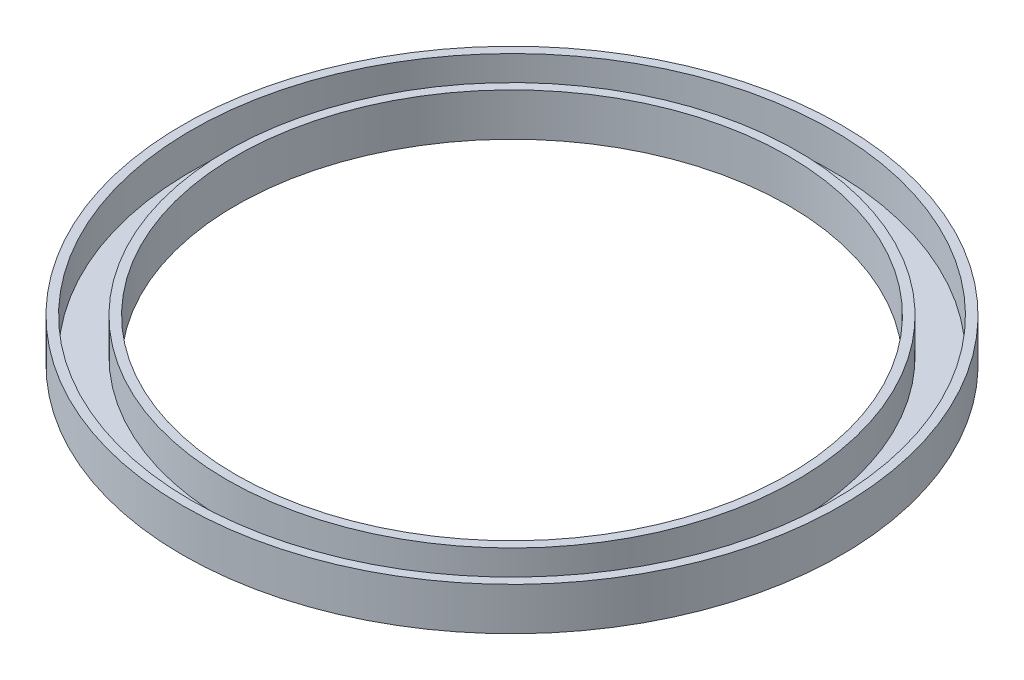
ISO-10303-21;
HEADER;
FILE_DESCRIPTION(('STEP AP214'),'2;1');
FILE_NAME('part.step','',(''),(''),'','','');
FILE_SCHEMA(('AUTOMOTIVE_DESIGN { 1 0 10303 214 1 1 1 1 }'));
ENDSEC;
DATA;
#1=APPLICATION_CONTEXT('core data for automotive mechanical design processes');
#2=APPLICATION_PROTOCOL_DEFINITION('international standard','automotive_design',2000,#1);
#3=PRODUCT_CONTEXT('',#1,'mechanical');
#4=PRODUCT('Part','Part','',(#3));
#5=PRODUCT_RELATED_PRODUCT_CATEGORY('part','',(#4));
#6=PRODUCT_DEFINITION_FORMATION('','',#4);
#7=PRODUCT_DEFINITION_CONTEXT('part definition',#1,'design');
#8=PRODUCT_DEFINITION('design','',#6,#7);
#9=PRODUCT_DEFINITION_SHAPE('','',#8);
#10=(LENGTH_UNIT() NAMED_UNIT(*) SI_UNIT(.MILLI.,.METRE.));
#11=(NAMED_UNIT(*) PLANE_ANGLE_UNIT() SI_UNIT($,.RADIAN.));
#12=(NAMED_UNIT(*) SI_UNIT($,.STERADIAN.) SOLID_ANGLE_UNIT());
#13=UNCERTAINTY_MEASURE_WITH_UNIT(LENGTH_MEASURE(1.E-05),#10,'distance_accuracy_value','');
#14=(GEOMETRIC_REPRESENTATION_CONTEXT(3) GLOBAL_UNCERTAINTY_ASSIGNED_CONTEXT((#13)) GLOBAL_UNIT_ASSIGNED_CONTEXT((#10,
#11,#12)) REPRESENTATION_CONTEXT('',''));
#15=CARTESIAN_POINT('',(0.,0.,0.));
#16=DIRECTION('',(0.,0.,1.));
#17=DIRECTION('',(1.,0.,0.));
#18=AXIS2_PLACEMENT_3D('',#15,#16,#17);
#19=CARTESIAN_POINT('',(0.,2.,0.));
#20=DIRECTION('',(0.,1.,0.));
#21=DIRECTION('',(0.,0.,1.));
#22=AXIS2_PLACEMENT_3D('',#19,#20,#21);
#23=PLANE('',#22);
#24=CARTESIAN_POINT('',(0.,2.,0.));
#25=DIRECTION('',(0.,1.,0.));
#26=DIRECTION('',(0.,0.,1.));
#27=AXIS2_PLACEMENT_3D('',#24,#25,#26);
#28=CIRCLE('',#27,80.);
#29=CARTESIAN_POINT('',(0.,2.,80.));
#30=VERTEX_POINT('',#29);
#31=EDGE_CURVE('E11',#30,#30,#28,.T.);
#32=ORIENTED_EDGE('',*,*,#31,.F.);
#33=EDGE_LOOP('',(#32));
#34=FACE_BOUND('',#33,.T.);
#35=CARTESIAN_POINT('',(0.,2.,0.));
#36=DIRECTION('',(0.,1.,0.));
#37=DIRECTION('',(0.,0.,1.));
#38=AXIS2_PLACEMENT_3D('',#35,#36,#37);
#39=CIRCLE('',#38,90.);
#40=CARTESIAN_POINT('',(0.,2.,90.));
#41=VERTEX_POINT('',#40);
#42=EDGE_CURVE('E54',#41,#41,#39,.F.);
#43=ORIENTED_EDGE('',*,*,#42,.F.);
#44=EDGE_LOOP('',(#43));
#45=FACE_BOUND('',#44,.T.);
#46=ADVANCED_FACE('F47',(#34,#45),#23,.T.);
#47=CARTESIAN_POINT('',(0.,0.,0.));
#48=DIRECTION('',(0.,1.,0.));
#49=DIRECTION('',(0.,0.,1.));
#50=AXIS2_PLACEMENT_3D('',#47,#48,#49);
#51=PLANE('',#50);
#52=CARTESIAN_POINT('',(0.,0.,0.));
#53=DIRECTION('',(0.,1.,0.));
#54=DIRECTION('',(0.,0.,1.));
#55=AXIS2_PLACEMENT_3D('',#52,#53,#54);
#56=CIRCLE('',#55,92.5);
#57=CARTESIAN_POINT('',(0.,0.,92.5));
#58=VERTEX_POINT('',#57);
#59=EDGE_CURVE('E65',#58,#58,#56,.T.);
#60=ORIENTED_EDGE('',*,*,#59,.F.);
#61=EDGE_LOOP('',(#60));
#62=FACE_BOUND('',#61,.T.);
#63=CARTESIAN_POINT('',(0.,0.,0.));
#64=DIRECTION('',(0.,1.,0.));
#65=DIRECTION('',(0.,0.,1.));
#66=AXIS2_PLACEMENT_3D('',#63,#64,#65);
#67=CIRCLE('',#66,77.5);
#68=CARTESIAN_POINT('',(0.,0.,77.5));
#69=VERTEX_POINT('',#68);
#70=EDGE_CURVE('E71',#69,#69,#67,.T.);
#71=ORIENTED_EDGE('',*,*,#70,.T.);
#72=EDGE_LOOP('',(#71));
#73=FACE_BOUND('',#72,.T.);
#74=ADVANCED_FACE('F49',(#62,#73),#51,.F.);
#75=CARTESIAN_POINT('',(0.,12.,0.));
#76=DIRECTION('',(0.,-1.,0.));
#77=DIRECTION('',(0.,0.,-1.));
#78=AXIS2_PLACEMENT_3D('',#75,#76,#77);
#79=CYLINDRICAL_SURFACE('',#78,90.);
#80=ORIENTED_EDGE('',*,*,#42,.T.);
#81=EDGE_LOOP('',(#80));
#82=FACE_BOUND('',#81,.T.);
#83=CARTESIAN_POINT('',(0.,12.,0.));
#84=DIRECTION('',(0.,1.,0.));
#85=DIRECTION('',(0.,0.,1.));
#86=AXIS2_PLACEMENT_3D('',#83,#84,#85);
#87=CIRCLE('',#86,90.);
#88=CARTESIAN_POINT('',(0.,12.,90.));
#89=VERTEX_POINT('',#88);
#90=EDGE_CURVE('E62',#89,#89,#87,.T.);
#91=ORIENTED_EDGE('',*,*,#90,.T.);
#92=EDGE_LOOP('',(#91));
#93=FACE_BOUND('',#92,.T.);
#94=ADVANCED_FACE('F102',(#82,#93),#79,.F.);
#95=CARTESIAN_POINT('',(0.,12.,0.));
#96=DIRECTION('',(0.,-1.,0.));
#97=DIRECTION('',(0.,0.,-1.));
#98=AXIS2_PLACEMENT_3D('',#95,#96,#97);
#99=CYLINDRICAL_SURFACE('',#98,92.5);
#100=CARTESIAN_POINT('',(0.,12.,0.));
#101=DIRECTION('',(0.,1.,0.));
#102=DIRECTION('',(0.,0.,1.));
#103=AXIS2_PLACEMENT_3D('',#100,#101,#102);
#104=CIRCLE('',#103,92.5);
#105=CARTESIAN_POINT('',(0.,12.,92.5));
#106=VERTEX_POINT('',#105);
#107=EDGE_CURVE('E58',#106,#106,#104,.T.);
#108=ORIENTED_EDGE('',*,*,#107,.F.);
#109=EDGE_LOOP('',(#108));
#110=FACE_BOUND('',#109,.T.);
#111=ORIENTED_EDGE('',*,*,#59,.T.);
#112=EDGE_LOOP('',(#111));
#113=FACE_BOUND('',#112,.T.);
#114=ADVANCED_FACE('F108',(#110,#113),#99,.T.);
#115=CARTESIAN_POINT('',(0.,12.,0.));
#116=DIRECTION('',(0.,1.,0.));
#117=DIRECTION('',(0.,0.,1.));
#118=AXIS2_PLACEMENT_3D('',#115,#116,#117);
#119=PLANE('',#118);
#120=ORIENTED_EDGE('',*,*,#90,.F.);
#121=EDGE_LOOP('',(#120));
#122=FACE_BOUND('',#121,.T.);
#123=ORIENTED_EDGE('',*,*,#107,.T.);
#124=EDGE_LOOP('',(#123));
#125=FACE_BOUND('',#124,.T.);
#126=ADVANCED_FACE('F95',(#122,#125),#119,.T.);
#127=CARTESIAN_POINT('',(0.,12.,0.));
#128=DIRECTION('',(0.,-1.,0.));
#129=DIRECTION('',(0.,0.,-1.));
#130=AXIS2_PLACEMENT_3D('',#127,#128,#129);
#131=CYLINDRICAL_SURFACE('',#130,77.5);
#132=CARTESIAN_POINT('',(0.,12.,0.));
#133=DIRECTION('',(0.,1.,0.));
#134=DIRECTION('',(0.,0.,1.));
#135=AXIS2_PLACEMENT_3D('',#132,#133,#134);
#136=CIRCLE('',#135,77.5);
#137=CARTESIAN_POINT('',(0.,12.,77.5));
#138=VERTEX_POINT('',#137);
#139=EDGE_CURVE('E74',#138,#138,#136,.T.);
#140=ORIENTED_EDGE('',*,*,#139,.T.);
#141=EDGE_LOOP('',(#140));
#142=FACE_BOUND('',#141,.T.);
#143=ORIENTED_EDGE('',*,*,#70,.F.);
#144=EDGE_LOOP('',(#143));
#145=FACE_BOUND('',#144,.T.);
#146=ADVANCED_FACE('F80',(#142,#145),#131,.F.);
#147=CARTESIAN_POINT('',(0.,12.,0.));
#148=DIRECTION('',(0.,-1.,0.));
#149=DIRECTION('',(0.,0.,-1.));
#150=AXIS2_PLACEMENT_3D('',#147,#148,#149);
#151=CYLINDRICAL_SURFACE('',#150,80.);
#152=ORIENTED_EDGE('',*,*,#31,.T.);
#153=EDGE_LOOP('',(#152));
#154=FACE_BOUND('',#153,.T.);
#155=CARTESIAN_POINT('',(0.,12.,0.));
#156=DIRECTION('',(0.,1.,0.));
#157=DIRECTION('',(0.,0.,1.));
#158=AXIS2_PLACEMENT_3D('',#155,#156,#157);
#159=CIRCLE('',#158,80.);
#160=CARTESIAN_POINT('',(0.,12.,80.));
#161=VERTEX_POINT('',#160);
#162=EDGE_CURVE('E67',#161,#161,#159,.T.);
#163=ORIENTED_EDGE('',*,*,#162,.F.);
#164=EDGE_LOOP('',(#163));
#165=FACE_BOUND('',#164,.T.);
#166=ADVANCED_FACE('F86',(#154,#165),#151,.T.);
#167=CARTESIAN_POINT('',(0.,12.,0.));
#168=DIRECTION('',(0.,1.,0.));
#169=DIRECTION('',(0.,0.,1.));
#170=AXIS2_PLACEMENT_3D('',#167,#168,#169);
#171=PLANE('',#170);
#172=ORIENTED_EDGE('',*,*,#139,.F.);
#173=EDGE_LOOP('',(#172));
#174=FACE_BOUND('',#173,.T.);
#175=ORIENTED_EDGE('',*,*,#162,.T.);
#176=EDGE_LOOP('',(#175));
#177=FACE_BOUND('',#176,.T.);
#178=ADVANCED_FACE('F83',(#174,#177),#171,.T.);
#179=CLOSED_SHELL('',(#46,#74,#94,#114,#126,#146,#166,#178));
#180=MANIFOLD_SOLID_BREP('B2',#179);
#181=ADVANCED_BREP_SHAPE_REPRESENTATION('',(#18,#180),#14);
#182=SHAPE_DEFINITION_REPRESENTATION(#9,#181);
ENDSEC;
END-ISO-10303-21;
